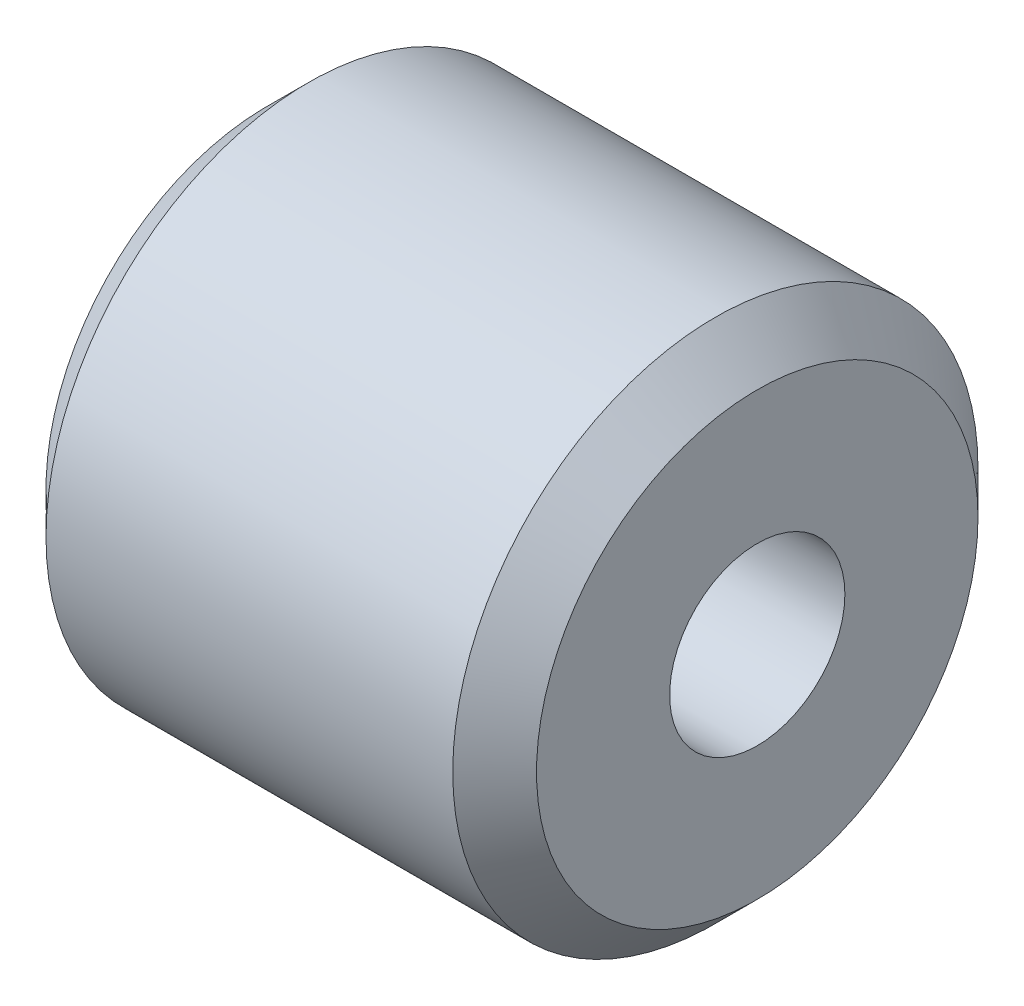
ISO-10303-21;
HEADER;
FILE_DESCRIPTION(('STEP AP214'),'2;1');
FILE_NAME('part.step','',(''),(''),'','','');
FILE_SCHEMA(('AUTOMOTIVE_DESIGN { 1 0 10303 214 1 1 1 1 }'));
ENDSEC;
DATA;
#1=APPLICATION_CONTEXT('core data for automotive mechanical design processes');
#2=APPLICATION_PROTOCOL_DEFINITION('international standard','automotive_design',2000,#1);
#3=PRODUCT_CONTEXT('',#1,'mechanical');
#4=PRODUCT('Part','Part','',(#3));
#5=PRODUCT_RELATED_PRODUCT_CATEGORY('part','',(#4));
#6=PRODUCT_DEFINITION_FORMATION('','',#4);
#7=PRODUCT_DEFINITION_CONTEXT('part definition',#1,'design');
#8=PRODUCT_DEFINITION('design','',#6,#7);
#9=PRODUCT_DEFINITION_SHAPE('','',#8);
#10=(LENGTH_UNIT() NAMED_UNIT(*) SI_UNIT(.MILLI.,.METRE.));
#11=(NAMED_UNIT(*) PLANE_ANGLE_UNIT() SI_UNIT($,.RADIAN.));
#12=(NAMED_UNIT(*) SI_UNIT($,.STERADIAN.) SOLID_ANGLE_UNIT());
#13=UNCERTAINTY_MEASURE_WITH_UNIT(LENGTH_MEASURE(1.E-05),#10,'distance_accuracy_value','');
#14=(GEOMETRIC_REPRESENTATION_CONTEXT(3) GLOBAL_UNCERTAINTY_ASSIGNED_CONTEXT((#13)) GLOBAL_UNIT_ASSIGNED_CONTEXT((#10,
#11,#12)) REPRESENTATION_CONTEXT('',''));
#15=CARTESIAN_POINT('',(0.,0.,0.));
#16=DIRECTION('',(0.,0.,1.));
#17=DIRECTION('',(1.,0.,0.));
#18=AXIS2_PLACEMENT_3D('',#15,#16,#17);
#19=CARTESIAN_POINT('',(4.45,0.,0.));
#20=DIRECTION('',(1.,0.,0.));
#21=DIRECTION('',(0.,0.,-1.));
#22=AXIS2_PLACEMENT_3D('',#19,#20,#21);
#23=PLANE('',#22);
#24=CARTESIAN_POINT('',(4.45,0.,0.));
#25=DIRECTION('',(1.,0.,0.));
#26=DIRECTION('',(0.,0.,-1.));
#27=AXIS2_PLACEMENT_3D('',#24,#25,#26);
#28=CIRCLE('',#27,4.005);
#29=CARTESIAN_POINT('',(4.45,0.,-4.005));
#30=VERTEX_POINT('',#29);
#31=EDGE_CURVE('E10',#30,#30,#28,.T.);
#32=ORIENTED_EDGE('',*,*,#31,.T.);
#33=EDGE_LOOP('',(#32));
#34=FACE_BOUND('',#33,.T.);
#35=CARTESIAN_POINT('',(4.45,0.,0.));
#36=DIRECTION('',(1.,0.,0.));
#37=DIRECTION('',(0.,0.,-1.));
#38=AXIS2_PLACEMENT_3D('',#35,#36,#37);
#39=CIRCLE('',#38,1.59);
#40=CARTESIAN_POINT('',(4.45,0.,-1.59));
#41=VERTEX_POINT('',#40);
#42=EDGE_CURVE('E54',#41,#41,#39,.T.);
#43=ORIENTED_EDGE('',*,*,#42,.F.);
#44=EDGE_LOOP('',(#43));
#45=FACE_BOUND('',#44,.T.);
#46=ADVANCED_FACE('F33',(#34,#45),#23,.T.);
#47=CARTESIAN_POINT('',(-4.45,0.,0.));
#48=DIRECTION('',(1.,0.,0.));
#49=DIRECTION('',(0.,0.,-1.));
#50=AXIS2_PLACEMENT_3D('',#47,#48,#49);
#51=PLANE('',#50);
#52=CARTESIAN_POINT('',(-4.45,0.,0.));
#53=DIRECTION('',(1.,0.,0.));
#54=DIRECTION('',(0.,0.,-1.));
#55=AXIS2_PLACEMENT_3D('',#52,#53,#54);
#56=CIRCLE('',#55,4.00499999999999);
#57=CARTESIAN_POINT('',(-4.45,0.,-4.00499999999999));
#58=VERTEX_POINT('',#57);
#59=EDGE_CURVE('E41',#58,#58,#56,.F.);
#60=ORIENTED_EDGE('',*,*,#59,.T.);
#61=EDGE_LOOP('',(#60));
#62=FACE_BOUND('',#61,.T.);
#63=CARTESIAN_POINT('',(-4.45,0.,0.));
#64=DIRECTION('',(1.,0.,0.));
#65=DIRECTION('',(0.,0.,-1.));
#66=AXIS2_PLACEMENT_3D('',#63,#64,#65);
#67=CIRCLE('',#66,1.59);
#68=CARTESIAN_POINT('',(-4.45,0.,-1.59));
#69=VERTEX_POINT('',#68);
#70=EDGE_CURVE('E55',#69,#69,#67,.T.);
#71=ORIENTED_EDGE('',*,*,#70,.T.);
#72=EDGE_LOOP('',(#71));
#73=FACE_BOUND('',#72,.T.);
#74=ADVANCED_FACE('F65',(#62,#73),#51,.F.);
#75=CARTESIAN_POINT('',(4.45,0.,0.));
#76=DIRECTION('',(-1.,0.,0.));
#77=DIRECTION('',(0.,0.,1.));
#78=AXIS2_PLACEMENT_3D('',#75,#76,#77);
#79=CYLINDRICAL_SURFACE('',#78,4.765);
#80=CARTESIAN_POINT('',(-3.69,0.,0.));
#81=DIRECTION('',(1.,0.,0.));
#82=DIRECTION('',(0.,0.,-1.));
#83=AXIS2_PLACEMENT_3D('',#80,#81,#82);
#84=CIRCLE('',#83,4.765);
#85=CARTESIAN_POINT('',(-3.69,0.,-4.765));
#86=VERTEX_POINT('',#85);
#87=EDGE_CURVE('E45',#86,#86,#84,.T.);
#88=ORIENTED_EDGE('',*,*,#87,.T.);
#89=EDGE_LOOP('',(#88));
#90=FACE_BOUND('',#89,.T.);
#91=CARTESIAN_POINT('',(3.69,0.,0.));
#92=DIRECTION('',(1.,0.,0.));
#93=DIRECTION('',(0.,0.,-1.));
#94=AXIS2_PLACEMENT_3D('',#91,#92,#93);
#95=CIRCLE('',#94,4.765);
#96=CARTESIAN_POINT('',(3.69,0.,-4.765));
#97=VERTEX_POINT('',#96);
#98=EDGE_CURVE('E49',#97,#97,#95,.F.);
#99=ORIENTED_EDGE('',*,*,#98,.T.);
#100=EDGE_LOOP('',(#99));
#101=FACE_BOUND('',#100,.T.);
#102=ADVANCED_FACE('F70',(#90,#101),#79,.T.);
#103=CARTESIAN_POINT('',(4.45,0.,0.));
#104=DIRECTION('',(-1.,0.,0.));
#105=DIRECTION('',(0.,0.,1.));
#106=AXIS2_PLACEMENT_3D('',#103,#104,#105);
#107=CYLINDRICAL_SURFACE('',#106,1.59);
#108=ORIENTED_EDGE('',*,*,#42,.T.);
#109=EDGE_LOOP('',(#108));
#110=FACE_BOUND('',#109,.T.);
#111=ORIENTED_EDGE('',*,*,#70,.F.);
#112=EDGE_LOOP('',(#111));
#113=FACE_BOUND('',#112,.T.);
#114=ADVANCED_FACE('F61',(#110,#113),#107,.F.);
#115=CARTESIAN_POINT('',(-3.69,0.,0.));
#116=DIRECTION('',(1.,0.,0.));
#117=DIRECTION('',(0.,0.,-1.));
#118=AXIS2_PLACEMENT_3D('',#115,#116,#117);
#119=CONICAL_SURFACE('',#118,4.765,0.78539816339745);
#120=ORIENTED_EDGE('',*,*,#59,.F.);
#121=EDGE_LOOP('',(#120));
#122=FACE_BOUND('',#121,.T.);
#123=ORIENTED_EDGE('',*,*,#87,.F.);
#124=EDGE_LOOP('',(#123));
#125=FACE_BOUND('',#124,.T.);
#126=ADVANCED_FACE('F77',(#122,#125),#119,.T.);
#127=CARTESIAN_POINT('',(4.45,0.,0.));
#128=DIRECTION('',(-1.,0.,0.));
#129=DIRECTION('',(0.,0.,1.));
#130=AXIS2_PLACEMENT_3D('',#127,#128,#129);
#131=CONICAL_SURFACE('',#130,4.005,0.785398163397447);
#132=ORIENTED_EDGE('',*,*,#98,.F.);
#133=EDGE_LOOP('',(#132));
#134=FACE_BOUND('',#133,.T.);
#135=ORIENTED_EDGE('',*,*,#31,.F.);
#136=EDGE_LOOP('',(#135));
#137=FACE_BOUND('',#136,.T.);
#138=ADVANCED_FACE('F36',(#134,#137),#131,.T.);
#139=CLOSED_SHELL('',(#46,#74,#102,#114,#126,#138));
#140=MANIFOLD_SOLID_BREP('B2',#139);
#141=ADVANCED_BREP_SHAPE_REPRESENTATION('',(#18,#140),#14);
#142=SHAPE_DEFINITION_REPRESENTATION(#9,#141);
ENDSEC;
END-ISO-10303-21;
